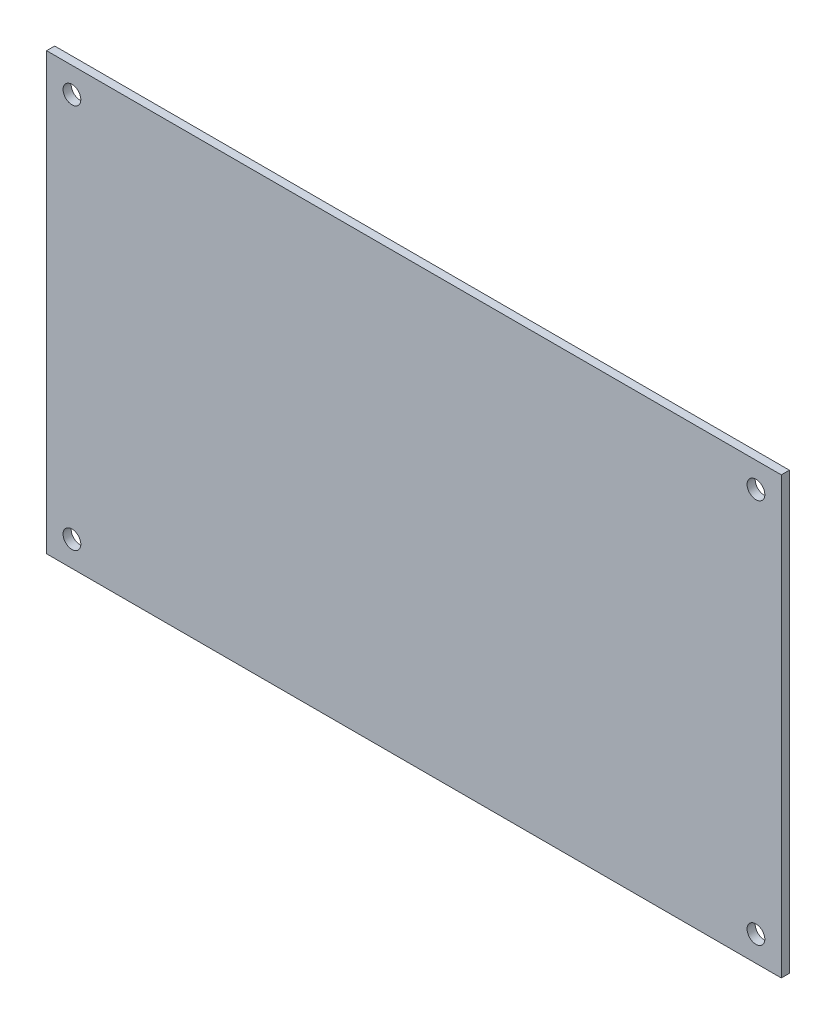
ISO-10303-21;
HEADER;
FILE_DESCRIPTION(('STEP AP214'),'2;1');
FILE_NAME('part.step','',(''),(''),'','','');
FILE_SCHEMA(('AUTOMOTIVE_DESIGN { 1 0 10303 214 1 1 1 1 }'));
ENDSEC;
DATA;
#1=APPLICATION_CONTEXT('core data for automotive mechanical design processes');
#2=APPLICATION_PROTOCOL_DEFINITION('international standard','automotive_design',2000,#1);
#3=PRODUCT_CONTEXT('',#1,'mechanical');
#4=PRODUCT('Part','Part','',(#3));
#5=PRODUCT_RELATED_PRODUCT_CATEGORY('part','',(#4));
#6=PRODUCT_DEFINITION_FORMATION('','',#4);
#7=PRODUCT_DEFINITION_CONTEXT('part definition',#1,'design');
#8=PRODUCT_DEFINITION('design','',#6,#7);
#9=PRODUCT_DEFINITION_SHAPE('','',#8);
#10=(LENGTH_UNIT() NAMED_UNIT(*) SI_UNIT(.MILLI.,.METRE.));
#11=(NAMED_UNIT(*) PLANE_ANGLE_UNIT() SI_UNIT($,.RADIAN.));
#12=(NAMED_UNIT(*) SI_UNIT($,.STERADIAN.) SOLID_ANGLE_UNIT());
#13=UNCERTAINTY_MEASURE_WITH_UNIT(LENGTH_MEASURE(1.E-05),#10,'distance_accuracy_value','');
#14=(GEOMETRIC_REPRESENTATION_CONTEXT(3) GLOBAL_UNCERTAINTY_ASSIGNED_CONTEXT((#13)) GLOBAL_UNIT_ASSIGNED_CONTEXT((#10,
#11,#12)) REPRESENTATION_CONTEXT('',''));
#15=CARTESIAN_POINT('',(0.,0.,0.));
#16=DIRECTION('',(0.,0.,1.));
#17=DIRECTION('',(1.,0.,0.));
#18=AXIS2_PLACEMENT_3D('',#15,#16,#17);
#19=CARTESIAN_POINT('',(48.4423506910812,22.6008886002444,0.5));
#20=DIRECTION('',(0.,0.,1.));
#21=DIRECTION('',(1.,0.,0.));
#22=AXIS2_PLACEMENT_3D('',#19,#20,#21);
#23=PLANE('',#22);
#24=DIRECTION('',(1.,0.,0.));
#25=VECTOR('',#24,1.);
#26=CARTESIAN_POINT('',(-14.0576493089189,55.6008886002444,0.5));
#27=LINE('',#26,#25);
#28=CARTESIAN_POINT('',(-14.0576493089188,55.6008886002444,0.5));
#29=VERTEX_POINT('',#28);
#30=CARTESIAN_POINT('',(110.942350691081,55.6008886002444,0.5));
#31=VERTEX_POINT('',#30);
#32=EDGE_CURVE('E82',#29,#31,#27,.T.);
#33=ORIENTED_EDGE('',*,*,#32,.T.);
#34=DIRECTION('',(0.,1.,0.));
#35=VECTOR('',#34,1.);
#36=CARTESIAN_POINT('',(110.942350691081,55.6008886002444,0.5));
#37=LINE('',#36,#35);
#38=CARTESIAN_POINT('',(110.942350691081,-10.3991113997556,0.5));
#39=VERTEX_POINT('',#38);
#40=EDGE_CURVE('E79',#31,#39,#37,.F.);
#41=ORIENTED_EDGE('',*,*,#40,.T.);
#42=DIRECTION('',(1.,0.,0.));
#43=VECTOR('',#42,1.);
#44=CARTESIAN_POINT('',(110.942350691081,-10.3991113997556,0.5));
#45=LINE('',#44,#43);
#46=CARTESIAN_POINT('',(-14.0576493089188,-10.3991113997556,0.5));
#47=VERTEX_POINT('',#46);
#48=EDGE_CURVE('E102',#39,#47,#45,.F.);
#49=ORIENTED_EDGE('',*,*,#48,.T.);
#50=DIRECTION('',(0.,1.,0.));
#51=VECTOR('',#50,1.);
#52=CARTESIAN_POINT('',(-14.0576493089188,-10.3991113997556,0.5));
#53=LINE('',#52,#51);
#54=EDGE_CURVE('E85',#47,#29,#53,.T.);
#55=ORIENTED_EDGE('',*,*,#54,.T.);
#56=EDGE_LOOP('',(#33,#41,#49,#55));
#57=FACE_BOUND('',#56,.T.);
#58=ADVANCED_FACE('F17',(#57),#23,.F.);
#59=CARTESIAN_POINT('',(-14.0576493089189,55.6008886002444,0.));
#60=DIRECTION('',(0.,1.,0.));
#61=DIRECTION('',(0.,0.,1.));
#62=AXIS2_PLACEMENT_3D('',#59,#60,#61);
#63=PLANE('',#62);
#64=DIRECTION('',(0.,0.,1.));
#65=VECTOR('',#64,1.);
#66=CARTESIAN_POINT('',(-14.0576493089188,55.6008886002444,0.));
#67=LINE('',#66,#65);
#68=CARTESIAN_POINT('',(-14.0576493089188,55.6008886002444,0.));
#69=VERTEX_POINT('',#68);
#70=EDGE_CURVE('E165',#29,#69,#67,.F.);
#71=ORIENTED_EDGE('',*,*,#70,.T.);
#72=DIRECTION('',(1.,0.,0.));
#73=VECTOR('',#72,1.);
#74=CARTESIAN_POINT('',(48.4423506910812,55.6008886002444,0.));
#75=LINE('',#74,#73);
#76=CARTESIAN_POINT('',(110.942350691081,55.6008886002444,0.));
#77=VERTEX_POINT('',#76);
#78=EDGE_CURVE('E93',#69,#77,#75,.T.);
#79=ORIENTED_EDGE('',*,*,#78,.T.);
#80=DIRECTION('',(0.,0.,-1.));
#81=VECTOR('',#80,1.);
#82=CARTESIAN_POINT('',(110.942350691081,55.6008886002444,0.));
#83=LINE('',#82,#81);
#84=EDGE_CURVE('E88',#77,#31,#83,.F.);
#85=ORIENTED_EDGE('',*,*,#84,.T.);
#86=ORIENTED_EDGE('',*,*,#32,.F.);
#87=EDGE_LOOP('',(#71,#79,#85,#86));
#88=FACE_BOUND('',#87,.T.);
#89=ADVANCED_FACE('F91',(#88),#63,.F.);
#90=CARTESIAN_POINT('',(110.942350691081,55.6008886002444,0.));
#91=DIRECTION('',(1.,0.,0.));
#92=DIRECTION('',(0.,0.,-1.));
#93=AXIS2_PLACEMENT_3D('',#90,#91,#92);
#94=PLANE('',#93);
#95=ORIENTED_EDGE('',*,*,#84,.F.);
#96=DIRECTION('',(0.,1.,0.));
#97=VECTOR('',#96,1.);
#98=CARTESIAN_POINT('',(110.942350691081,22.6008886002444,0.));
#99=LINE('',#98,#97);
#100=CARTESIAN_POINT('',(110.942350691081,-10.3991113997556,0.));
#101=VERTEX_POINT('',#100);
#102=EDGE_CURVE('E158',#77,#101,#99,.F.);
#103=ORIENTED_EDGE('',*,*,#102,.T.);
#104=DIRECTION('',(0.,0.,-1.));
#105=VECTOR('',#104,1.);
#106=CARTESIAN_POINT('',(110.942350691081,-10.3991113997556,0.));
#107=LINE('',#106,#105);
#108=EDGE_CURVE('E99',#101,#39,#107,.F.);
#109=ORIENTED_EDGE('',*,*,#108,.T.);
#110=ORIENTED_EDGE('',*,*,#40,.F.);
#111=EDGE_LOOP('',(#95,#103,#109,#110));
#112=FACE_BOUND('',#111,.T.);
#113=ADVANCED_FACE('F97',(#112),#94,.F.);
#114=CARTESIAN_POINT('',(110.942350691081,-10.3991113997556,0.));
#115=DIRECTION('',(0.,-1.,0.));
#116=DIRECTION('',(0.,0.,-1.));
#117=AXIS2_PLACEMENT_3D('',#114,#115,#116);
#118=PLANE('',#117);
#119=ORIENTED_EDGE('',*,*,#108,.F.);
#120=DIRECTION('',(1.,0.,0.));
#121=VECTOR('',#120,1.);
#122=CARTESIAN_POINT('',(48.4423506910812,-10.3991113997556,0.));
#123=LINE('',#122,#121);
#124=CARTESIAN_POINT('',(-14.0576493089188,-10.3991113997556,0.));
#125=VERTEX_POINT('',#124);
#126=EDGE_CURVE('E156',#101,#125,#123,.F.);
#127=ORIENTED_EDGE('',*,*,#126,.T.);
#128=DIRECTION('',(0.,0.,1.));
#129=VECTOR('',#128,1.);
#130=CARTESIAN_POINT('',(-14.0576493089188,-10.3991113997556,0.));
#131=LINE('',#130,#129);
#132=EDGE_CURVE('E162',#125,#47,#131,.T.);
#133=ORIENTED_EDGE('',*,*,#132,.T.);
#134=ORIENTED_EDGE('',*,*,#48,.F.);
#135=EDGE_LOOP('',(#119,#127,#133,#134));
#136=FACE_BOUND('',#135,.T.);
#137=ADVANCED_FACE('F168',(#136),#118,.F.);
#138=CARTESIAN_POINT('',(-14.0576493089188,-10.3991113997556,0.));
#139=DIRECTION('',(-1.,0.,0.));
#140=DIRECTION('',(0.,0.,1.));
#141=AXIS2_PLACEMENT_3D('',#138,#139,#140);
#142=PLANE('',#141);
#143=ORIENTED_EDGE('',*,*,#132,.F.);
#144=DIRECTION('',(0.,1.,0.));
#145=VECTOR('',#144,1.);
#146=CARTESIAN_POINT('',(-14.0576493089188,22.6008886002444,0.));
#147=LINE('',#146,#145);
#148=EDGE_CURVE('E153',#125,#69,#147,.T.);
#149=ORIENTED_EDGE('',*,*,#148,.T.);
#150=ORIENTED_EDGE('',*,*,#70,.F.);
#151=ORIENTED_EDGE('',*,*,#54,.F.);
#152=EDGE_LOOP('',(#143,#149,#150,#151));
#153=FACE_BOUND('',#152,.T.);
#154=ADVANCED_FACE('F172',(#153),#142,.F.);
#155=CARTESIAN_POINT('',(48.4423506910812,22.6008886002444,0.));
#156=DIRECTION('',(0.,0.,1.));
#157=DIRECTION('',(1.,0.,0.));
#158=AXIS2_PLACEMENT_3D('',#155,#156,#157);
#159=PLANE('',#158);
#160=ORIENTED_EDGE('',*,*,#126,.F.);
#161=ORIENTED_EDGE('',*,*,#102,.F.);
#162=ORIENTED_EDGE('',*,*,#78,.F.);
#163=ORIENTED_EDGE('',*,*,#148,.F.);
#164=EDGE_LOOP('',(#160,#161,#162,#163));
#165=FACE_BOUND('',#164,.T.);
#166=CARTESIAN_POINT('',(-19.0576493089189,60.6008886002444,0.));
#167=DIRECTION('',(0.,0.,1.));
#168=DIRECTION('',(1.,0.,0.));
#169=AXIS2_PLACEMENT_3D('',#166,#167,#168);
#170=CIRCLE('',#169,1.75);
#171=CARTESIAN_POINT('',(-17.3076493089189,60.6008886002444,0.));
#172=VERTEX_POINT('',#171);
#173=EDGE_CURVE('E115',#172,#172,#170,.T.);
#174=ORIENTED_EDGE('',*,*,#173,.T.);
#175=EDGE_LOOP('',(#174));
#176=FACE_BOUND('',#175,.T.);
#177=CARTESIAN_POINT('',(115.942350691081,60.6008886002444,0.));
#178=DIRECTION('',(0.,0.,1.));
#179=DIRECTION('',(1.,0.,0.));
#180=AXIS2_PLACEMENT_3D('',#177,#178,#179);
#181=CIRCLE('',#180,1.75);
#182=CARTESIAN_POINT('',(117.692350691081,60.6008886002444,0.));
#183=VERTEX_POINT('',#182);
#184=EDGE_CURVE('E119',#183,#183,#181,.T.);
#185=ORIENTED_EDGE('',*,*,#184,.T.);
#186=EDGE_LOOP('',(#185));
#187=FACE_BOUND('',#186,.T.);
#188=CARTESIAN_POINT('',(115.942350691081,-15.3991113997556,0.));
#189=DIRECTION('',(0.,0.,1.));
#190=DIRECTION('',(1.,0.,0.));
#191=AXIS2_PLACEMENT_3D('',#188,#189,#190);
#192=CIRCLE('',#191,1.75);
#193=CARTESIAN_POINT('',(117.692350691081,-15.3991113997556,0.));
#194=VERTEX_POINT('',#193);
#195=EDGE_CURVE('E121',#194,#194,#192,.T.);
#196=ORIENTED_EDGE('',*,*,#195,.T.);
#197=EDGE_LOOP('',(#196));
#198=FACE_BOUND('',#197,.T.);
#199=CARTESIAN_POINT('',(-19.0576493089188,-15.3991113997556,0.));
#200=DIRECTION('',(0.,0.,1.));
#201=DIRECTION('',(1.,0.,0.));
#202=AXIS2_PLACEMENT_3D('',#199,#200,#201);
#203=CIRCLE('',#202,1.75);
#204=CARTESIAN_POINT('',(-17.3076493089188,-15.3991113997556,0.));
#205=VERTEX_POINT('',#204);
#206=EDGE_CURVE('E20',#205,#205,#203,.T.);
#207=ORIENTED_EDGE('',*,*,#206,.T.);
#208=EDGE_LOOP('',(#207));
#209=FACE_BOUND('',#208,.T.);
#210=DIRECTION('',(0.,1.,0.));
#211=VECTOR('',#210,1.);
#212=CARTESIAN_POINT('',(120.942350691081,65.6008886002444,0.));
#213=LINE('',#212,#211);
#214=CARTESIAN_POINT('',(120.942350691081,-20.3991113997556,0.));
#215=VERTEX_POINT('',#214);
#216=CARTESIAN_POINT('',(120.942350691081,65.6008886002444,0.));
#217=VERTEX_POINT('',#216);
#218=EDGE_CURVE('E151',#215,#217,#213,.T.);
#219=ORIENTED_EDGE('',*,*,#218,.F.);
#220=DIRECTION('',(1.,0.,0.));
#221=VECTOR('',#220,1.);
#222=CARTESIAN_POINT('',(120.942350691081,-20.3991113997556,0.));
#223=LINE('',#222,#221);
#224=CARTESIAN_POINT('',(-24.0576493089188,-20.3991113997556,0.));
#225=VERTEX_POINT('',#224);
#226=EDGE_CURVE('E130',#225,#215,#223,.T.);
#227=ORIENTED_EDGE('',*,*,#226,.F.);
#228=DIRECTION('',(0.,1.,0.));
#229=VECTOR('',#228,1.);
#230=CARTESIAN_POINT('',(-24.0576493089188,-20.3991113997556,0.));
#231=LINE('',#230,#229);
#232=CARTESIAN_POINT('',(-24.0576493089189,65.6008886002444,0.));
#233=VERTEX_POINT('',#232);
#234=EDGE_CURVE('E141',#233,#225,#231,.F.);
#235=ORIENTED_EDGE('',*,*,#234,.F.);
#236=DIRECTION('',(1.,0.,0.));
#237=VECTOR('',#236,1.);
#238=CARTESIAN_POINT('',(-24.0576493089189,65.6008886002444,0.));
#239=LINE('',#238,#237);
#240=EDGE_CURVE('E146',#217,#233,#239,.F.);
#241=ORIENTED_EDGE('',*,*,#240,.F.);
#242=EDGE_LOOP('',(#219,#227,#235,#241));
#243=FACE_BOUND('',#242,.T.);
#244=ADVANCED_FACE('F174',(#165,#176,#187,#198,#209,#243),#159,.F.);
#245=CARTESIAN_POINT('',(120.942350691081,65.6008886002444,0.));
#246=DIRECTION('',(1.,0.,0.));
#247=DIRECTION('',(0.,0.,-1.));
#248=AXIS2_PLACEMENT_3D('',#245,#246,#247);
#249=PLANE('',#248);
#250=ORIENTED_EDGE('',*,*,#218,.T.);
#251=DIRECTION('',(0.,0.,1.));
#252=VECTOR('',#251,1.);
#253=CARTESIAN_POINT('',(120.942350691081,65.6008886002444,0.));
#254=LINE('',#253,#252);
#255=CARTESIAN_POINT('',(120.942350691081,65.6008886002444,1.6));
#256=VERTEX_POINT('',#255);
#257=EDGE_CURVE('E148',#256,#217,#254,.F.);
#258=ORIENTED_EDGE('',*,*,#257,.F.);
#259=DIRECTION('',(0.,1.,0.));
#260=VECTOR('',#259,1.);
#261=CARTESIAN_POINT('',(120.942350691081,22.6008886002444,1.6));
#262=LINE('',#261,#260);
#263=CARTESIAN_POINT('',(120.942350691081,-20.3991113997556,1.6));
#264=VERTEX_POINT('',#263);
#265=EDGE_CURVE('E118',#264,#256,#262,.T.);
#266=ORIENTED_EDGE('',*,*,#265,.F.);
#267=DIRECTION('',(0.,0.,-1.));
#268=VECTOR('',#267,1.);
#269=CARTESIAN_POINT('',(120.942350691081,-20.3991113997556,0.));
#270=LINE('',#269,#268);
#271=EDGE_CURVE('E126',#215,#264,#270,.F.);
#272=ORIENTED_EDGE('',*,*,#271,.F.);
#273=EDGE_LOOP('',(#250,#258,#266,#272));
#274=FACE_BOUND('',#273,.T.);
#275=ADVANCED_FACE('F177',(#274),#249,.T.);
#276=CARTESIAN_POINT('',(-24.0576493089189,65.6008886002444,0.));
#277=DIRECTION('',(0.,1.,0.));
#278=DIRECTION('',(0.,0.,1.));
#279=AXIS2_PLACEMENT_3D('',#276,#277,#278);
#280=PLANE('',#279);
#281=ORIENTED_EDGE('',*,*,#240,.T.);
#282=DIRECTION('',(0.,0.,1.));
#283=VECTOR('',#282,1.);
#284=CARTESIAN_POINT('',(-24.0576493089188,65.6008886002444,0.));
#285=LINE('',#284,#283);
#286=CARTESIAN_POINT('',(-24.0576493089189,65.6008886002444,1.6));
#287=VERTEX_POINT('',#286);
#288=EDGE_CURVE('E143',#287,#233,#285,.F.);
#289=ORIENTED_EDGE('',*,*,#288,.F.);
#290=DIRECTION('',(1.,0.,0.));
#291=VECTOR('',#290,1.);
#292=CARTESIAN_POINT('',(48.4423506910812,65.6008886002444,1.6));
#293=LINE('',#292,#291);
#294=EDGE_CURVE('E196',#256,#287,#293,.F.);
#295=ORIENTED_EDGE('',*,*,#294,.F.);
#296=ORIENTED_EDGE('',*,*,#257,.T.);
#297=EDGE_LOOP('',(#281,#289,#295,#296));
#298=FACE_BOUND('',#297,.T.);
#299=ADVANCED_FACE('F200',(#298),#280,.T.);
#300=CARTESIAN_POINT('',(-24.0576493089188,-20.3991113997556,0.));
#301=DIRECTION('',(-1.,0.,0.));
#302=DIRECTION('',(0.,0.,1.));
#303=AXIS2_PLACEMENT_3D('',#300,#301,#302);
#304=PLANE('',#303);
#305=ORIENTED_EDGE('',*,*,#234,.T.);
#306=DIRECTION('',(0.,0.,-1.));
#307=VECTOR('',#306,1.);
#308=CARTESIAN_POINT('',(-24.0576493089188,-20.3991113997556,0.));
#309=LINE('',#308,#307);
#310=CARTESIAN_POINT('',(-24.0576493089189,-20.3991113997556,1.6));
#311=VERTEX_POINT('',#310);
#312=EDGE_CURVE('E35',#311,#225,#309,.T.);
#313=ORIENTED_EDGE('',*,*,#312,.F.);
#314=DIRECTION('',(0.,1.,0.));
#315=VECTOR('',#314,1.);
#316=CARTESIAN_POINT('',(-24.0576493089189,22.6008886002444,1.6));
#317=LINE('',#316,#315);
#318=EDGE_CURVE('E191',#287,#311,#317,.F.);
#319=ORIENTED_EDGE('',*,*,#318,.F.);
#320=ORIENTED_EDGE('',*,*,#288,.T.);
#321=EDGE_LOOP('',(#305,#313,#319,#320));
#322=FACE_BOUND('',#321,.T.);
#323=ADVANCED_FACE('F198',(#322),#304,.T.);
#324=CARTESIAN_POINT('',(120.942350691081,-20.3991113997556,0.));
#325=DIRECTION('',(0.,-1.,0.));
#326=DIRECTION('',(0.,0.,-1.));
#327=AXIS2_PLACEMENT_3D('',#324,#325,#326);
#328=PLANE('',#327);
#329=ORIENTED_EDGE('',*,*,#226,.T.);
#330=ORIENTED_EDGE('',*,*,#271,.T.);
#331=DIRECTION('',(1.,0.,0.));
#332=VECTOR('',#331,1.);
#333=CARTESIAN_POINT('',(48.4423506910812,-20.3991113997556,1.6));
#334=LINE('',#333,#332);
#335=EDGE_CURVE('E114',#311,#264,#334,.T.);
#336=ORIENTED_EDGE('',*,*,#335,.F.);
#337=ORIENTED_EDGE('',*,*,#312,.T.);
#338=EDGE_LOOP('',(#329,#330,#336,#337));
#339=FACE_BOUND('',#338,.T.);
#340=ADVANCED_FACE('F188',(#339),#328,.T.);
#341=CARTESIAN_POINT('',(-19.0576493089188,-15.3991113997556,-2.4));
#342=DIRECTION('',(0.,0.,1.));
#343=DIRECTION('',(1.,0.,0.));
#344=AXIS2_PLACEMENT_3D('',#341,#342,#343);
#345=CYLINDRICAL_SURFACE('',#344,1.75);
#346=CARTESIAN_POINT('',(-19.0576493089188,-15.3991113997556,1.6));
#347=DIRECTION('',(0.,0.,1.));
#348=DIRECTION('',(1.,0.,0.));
#349=AXIS2_PLACEMENT_3D('',#346,#347,#348);
#350=CIRCLE('',#349,1.75);
#351=CARTESIAN_POINT('',(-17.3076493089188,-15.3991113997556,1.6));
#352=VERTEX_POINT('',#351);
#353=EDGE_CURVE('E111',#352,#352,#350,.F.);
#354=ORIENTED_EDGE('',*,*,#353,.F.);
#355=EDGE_LOOP('',(#354));
#356=FACE_BOUND('',#355,.T.);
#357=ORIENTED_EDGE('',*,*,#206,.F.);
#358=EDGE_LOOP('',(#357));
#359=FACE_BOUND('',#358,.T.);
#360=ADVANCED_FACE('F228',(#356,#359),#345,.F.);
#361=CARTESIAN_POINT('',(115.942350691081,-15.3991113997556,-2.4));
#362=DIRECTION('',(0.,0.,1.));
#363=DIRECTION('',(1.,0.,0.));
#364=AXIS2_PLACEMENT_3D('',#361,#362,#363);
#365=CYLINDRICAL_SURFACE('',#364,1.75);
#366=CARTESIAN_POINT('',(115.942350691081,-15.3991113997556,1.6));
#367=DIRECTION('',(0.,0.,1.));
#368=DIRECTION('',(1.,0.,0.));
#369=AXIS2_PLACEMENT_3D('',#366,#367,#368);
#370=CIRCLE('',#369,1.75);
#371=CARTESIAN_POINT('',(117.692350691081,-15.3991113997556,1.6));
#372=VERTEX_POINT('',#371);
#373=EDGE_CURVE('E108',#372,#372,#370,.F.);
#374=ORIENTED_EDGE('',*,*,#373,.F.);
#375=EDGE_LOOP('',(#374));
#376=FACE_BOUND('',#375,.T.);
#377=ORIENTED_EDGE('',*,*,#195,.F.);
#378=EDGE_LOOP('',(#377));
#379=FACE_BOUND('',#378,.T.);
#380=ADVANCED_FACE('F224',(#376,#379),#365,.F.);
#381=CARTESIAN_POINT('',(115.942350691081,60.6008886002444,-2.4));
#382=DIRECTION('',(0.,0.,1.));
#383=DIRECTION('',(1.,0.,0.));
#384=AXIS2_PLACEMENT_3D('',#381,#382,#383);
#385=CYLINDRICAL_SURFACE('',#384,1.75);
#386=CARTESIAN_POINT('',(115.942350691081,60.6008886002444,1.6));
#387=DIRECTION('',(0.,0.,1.));
#388=DIRECTION('',(1.,0.,0.));
#389=AXIS2_PLACEMENT_3D('',#386,#387,#388);
#390=CIRCLE('',#389,1.75);
#391=CARTESIAN_POINT('',(117.692350691081,60.6008886002444,1.6));
#392=VERTEX_POINT('',#391);
#393=EDGE_CURVE('E26',#392,#392,#390,.F.);
#394=ORIENTED_EDGE('',*,*,#393,.F.);
#395=EDGE_LOOP('',(#394));
#396=FACE_BOUND('',#395,.T.);
#397=ORIENTED_EDGE('',*,*,#184,.F.);
#398=EDGE_LOOP('',(#397));
#399=FACE_BOUND('',#398,.T.);
#400=ADVANCED_FACE('F217',(#396,#399),#385,.F.);
#401=CARTESIAN_POINT('',(-19.0576493089189,60.6008886002444,-2.4));
#402=DIRECTION('',(0.,0.,1.));
#403=DIRECTION('',(1.,0.,0.));
#404=AXIS2_PLACEMENT_3D('',#401,#402,#403);
#405=CYLINDRICAL_SURFACE('',#404,1.75);
#406=CARTESIAN_POINT('',(-19.0576493089189,60.6008886002444,1.6));
#407=DIRECTION('',(0.,0.,1.));
#408=DIRECTION('',(1.,0.,0.));
#409=AXIS2_PLACEMENT_3D('',#406,#407,#408);
#410=CIRCLE('',#409,1.75);
#411=CARTESIAN_POINT('',(-17.3076493089189,60.6008886002444,1.6));
#412=VERTEX_POINT('',#411);
#413=EDGE_CURVE('E11',#412,#412,#410,.F.);
#414=ORIENTED_EDGE('',*,*,#413,.F.);
#415=EDGE_LOOP('',(#414));
#416=FACE_BOUND('',#415,.T.);
#417=ORIENTED_EDGE('',*,*,#173,.F.);
#418=EDGE_LOOP('',(#417));
#419=FACE_BOUND('',#418,.T.);
#420=ADVANCED_FACE('F211',(#416,#419),#405,.F.);
#421=CARTESIAN_POINT('',(48.4423506910812,22.6008886002444,1.6));
#422=DIRECTION('',(0.,0.,1.));
#423=DIRECTION('',(1.,0.,0.));
#424=AXIS2_PLACEMENT_3D('',#421,#422,#423);
#425=PLANE('',#424);
#426=ORIENTED_EDGE('',*,*,#413,.T.);
#427=EDGE_LOOP('',(#426));
#428=FACE_BOUND('',#427,.T.);
#429=ORIENTED_EDGE('',*,*,#393,.T.);
#430=EDGE_LOOP('',(#429));
#431=FACE_BOUND('',#430,.T.);
#432=ORIENTED_EDGE('',*,*,#373,.T.);
#433=EDGE_LOOP('',(#432));
#434=FACE_BOUND('',#433,.T.);
#435=ORIENTED_EDGE('',*,*,#353,.T.);
#436=EDGE_LOOP('',(#435));
#437=FACE_BOUND('',#436,.T.);
#438=ORIENTED_EDGE('',*,*,#318,.T.);
#439=ORIENTED_EDGE('',*,*,#335,.T.);
#440=ORIENTED_EDGE('',*,*,#265,.T.);
#441=ORIENTED_EDGE('',*,*,#294,.T.);
#442=EDGE_LOOP('',(#438,#439,#440,#441));
#443=FACE_BOUND('',#442,.T.);
#444=ADVANCED_FACE('F194',(#428,#431,#434,#437,#443),#425,.T.);
#445=CLOSED_SHELL('',(#58,#89,#113,#137,#154,#244,#275,#299,#323,#340,#360,#380,#400,#420,#444));
#446=MANIFOLD_SOLID_BREP('B1',#445);
#447=ADVANCED_BREP_SHAPE_REPRESENTATION('',(#18,#446),#14);
#448=SHAPE_DEFINITION_REPRESENTATION(#9,#447);
ENDSEC;
END-ISO-10303-21;
